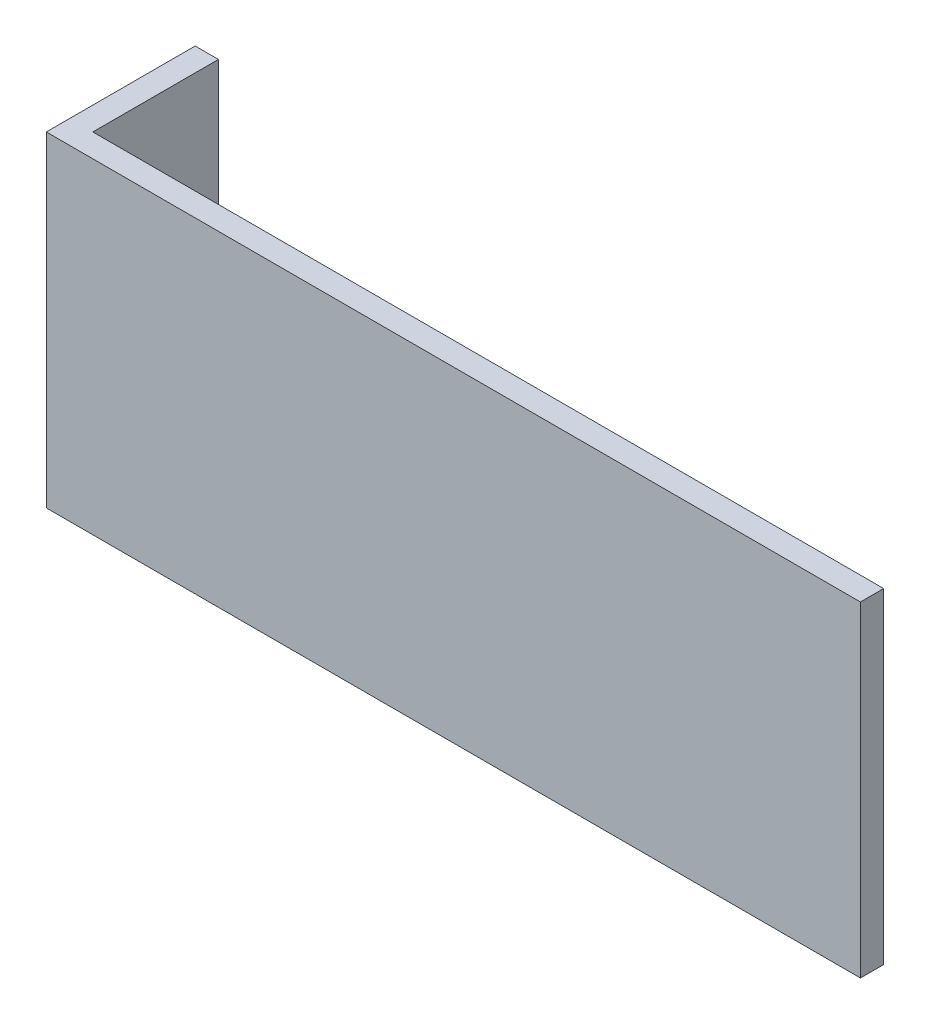
ISO-10303-21;
HEADER;
FILE_DESCRIPTION(('STEP AP214'),'2;1');
FILE_NAME('part.step','',(''),(''),'','','');
FILE_SCHEMA(('AUTOMOTIVE_DESIGN { 1 0 10303 214 1 1 1 1 }'));
ENDSEC;
DATA;
#1=APPLICATION_CONTEXT('core data for automotive mechanical design processes');
#2=APPLICATION_PROTOCOL_DEFINITION('international standard','automotive_design',2000,#1);
#3=PRODUCT_CONTEXT('',#1,'mechanical');
#4=PRODUCT('Part','Part','',(#3));
#5=PRODUCT_RELATED_PRODUCT_CATEGORY('part','',(#4));
#6=PRODUCT_DEFINITION_FORMATION('','',#4);
#7=PRODUCT_DEFINITION_CONTEXT('part definition',#1,'design');
#8=PRODUCT_DEFINITION('design','',#6,#7);
#9=PRODUCT_DEFINITION_SHAPE('','',#8);
#10=(LENGTH_UNIT() NAMED_UNIT(*) SI_UNIT(.MILLI.,.METRE.));
#11=(NAMED_UNIT(*) PLANE_ANGLE_UNIT() SI_UNIT($,.RADIAN.));
#12=(NAMED_UNIT(*) SI_UNIT($,.STERADIAN.) SOLID_ANGLE_UNIT());
#13=UNCERTAINTY_MEASURE_WITH_UNIT(LENGTH_MEASURE(1.E-05),#10,'distance_accuracy_value','');
#14=(GEOMETRIC_REPRESENTATION_CONTEXT(3) GLOBAL_UNCERTAINTY_ASSIGNED_CONTEXT((#13)) GLOBAL_UNIT_ASSIGNED_CONTEXT((#10,
#11,#12)) REPRESENTATION_CONTEXT('',''));
#15=CARTESIAN_POINT('',(0.,0.,0.));
#16=DIRECTION('',(0.,0.,1.));
#17=DIRECTION('',(1.,0.,0.));
#18=AXIS2_PLACEMENT_3D('',#15,#16,#17);
#19=CARTESIAN_POINT('',(-5.,70.,0.));
#20=DIRECTION('',(-1.,0.,0.));
#21=DIRECTION('',(0.,0.,1.));
#22=AXIS2_PLACEMENT_3D('',#19,#20,#21);
#23=PLANE('',#22);
#24=DIRECTION('',(0.,0.,-1.));
#25=VECTOR('',#24,1.);
#26=CARTESIAN_POINT('',(-5.,0.,0.));
#27=LINE('',#26,#25);
#28=CARTESIAN_POINT('',(-5.,0.,0.));
#29=VERTEX_POINT('',#28);
#30=CARTESIAN_POINT('',(-5.,0.,-32.));
#31=VERTEX_POINT('',#30);
#32=EDGE_CURVE('E123',#29,#31,#27,.T.);
#33=ORIENTED_EDGE('',*,*,#32,.F.);
#34=DIRECTION('',(0.,-1.,0.));
#35=VECTOR('',#34,1.);
#36=CARTESIAN_POINT('',(-5.,70.,0.));
#37=LINE('',#36,#35);
#38=CARTESIAN_POINT('',(-5.,70.,0.));
#39=VERTEX_POINT('',#38);
#40=EDGE_CURVE('E116',#39,#29,#37,.T.);
#41=ORIENTED_EDGE('',*,*,#40,.F.);
#42=DIRECTION('',(0.,0.,-1.));
#43=VECTOR('',#42,1.);
#44=CARTESIAN_POINT('',(-5.,70.,0.));
#45=LINE('',#44,#43);
#46=CARTESIAN_POINT('',(-5.,70.,-32.));
#47=VERTEX_POINT('',#46);
#48=EDGE_CURVE('E171',#39,#47,#45,.T.);
#49=ORIENTED_EDGE('',*,*,#48,.T.);
#50=DIRECTION('',(0.,-1.,0.));
#51=VECTOR('',#50,1.);
#52=CARTESIAN_POINT('',(-5.,70.,-32.));
#53=LINE('',#52,#51);
#54=EDGE_CURVE('E80',#47,#31,#53,.T.);
#55=ORIENTED_EDGE('',*,*,#54,.T.);
#56=EDGE_LOOP('',(#33,#41,#49,#55));
#57=FACE_BOUND('',#56,.T.);
#58=ADVANCED_FACE('F69',(#57),#23,.T.);
#59=CARTESIAN_POINT('',(0.,70.,-32.));
#60=DIRECTION('',(0.,0.,1.));
#61=DIRECTION('',(1.,0.,0.));
#62=AXIS2_PLACEMENT_3D('',#59,#60,#61);
#63=PLANE('',#62);
#64=DIRECTION('',(-1.,0.,0.));
#65=VECTOR('',#64,1.);
#66=CARTESIAN_POINT('',(0.,0.,-32.));
#67=LINE('',#66,#65);
#68=CARTESIAN_POINT('',(0.,0.,-32.));
#69=VERTEX_POINT('',#68);
#70=EDGE_CURVE('E131',#69,#31,#67,.T.);
#71=ORIENTED_EDGE('',*,*,#70,.T.);
#72=ORIENTED_EDGE('',*,*,#54,.F.);
#73=DIRECTION('',(-1.,0.,0.));
#74=VECTOR('',#73,1.);
#75=CARTESIAN_POINT('',(0.,70.,-32.));
#76=LINE('',#75,#74);
#77=CARTESIAN_POINT('',(0.,70.,-32.));
#78=VERTEX_POINT('',#77);
#79=EDGE_CURVE('E158',#78,#47,#76,.T.);
#80=ORIENTED_EDGE('',*,*,#79,.F.);
#81=DIRECTION('',(0.,-1.,0.));
#82=VECTOR('',#81,1.);
#83=CARTESIAN_POINT('',(0.,70.,-32.));
#84=LINE('',#83,#82);
#85=EDGE_CURVE('E151',#78,#69,#84,.T.);
#86=ORIENTED_EDGE('',*,*,#85,.T.);
#87=EDGE_LOOP('',(#71,#72,#80,#86));
#88=FACE_BOUND('',#87,.T.);
#89=ADVANCED_FACE('F189',(#88),#63,.F.);
#90=CARTESIAN_POINT('',(0.,0.,0.));
#91=DIRECTION('',(0.,-1.,0.));
#92=DIRECTION('',(0.,0.,-1.));
#93=AXIS2_PLACEMENT_3D('',#90,#91,#92);
#94=PLANE('',#93);
#95=ORIENTED_EDGE('',*,*,#70,.F.);
#96=DIRECTION('',(0.,0.,-1.));
#97=VECTOR('',#96,1.);
#98=CARTESIAN_POINT('',(0.,0.,0.));
#99=LINE('',#98,#97);
#100=CARTESIAN_POINT('',(0.,0.,-5.));
#101=VERTEX_POINT('',#100);
#102=EDGE_CURVE('E122',#101,#69,#99,.T.);
#103=ORIENTED_EDGE('',*,*,#102,.F.);
#104=DIRECTION('',(1.,0.,0.));
#105=VECTOR('',#104,1.);
#106=CARTESIAN_POINT('',(0.,0.,-5.));
#107=LINE('',#106,#105);
#108=CARTESIAN_POINT('',(170.,0.,-5.00000000000001));
#109=VERTEX_POINT('',#108);
#110=EDGE_CURVE('E135',#101,#109,#107,.T.);
#111=ORIENTED_EDGE('',*,*,#110,.T.);
#112=DIRECTION('',(0.,0.,-1.));
#113=VECTOR('',#112,1.);
#114=CARTESIAN_POINT('',(170.,0.,0.));
#115=LINE('',#114,#113);
#116=CARTESIAN_POINT('',(170.,0.,0.));
#117=VERTEX_POINT('',#116);
#118=EDGE_CURVE('E127',#117,#109,#115,.T.);
#119=ORIENTED_EDGE('',*,*,#118,.F.);
#120=DIRECTION('',(-1.,0.,0.));
#121=VECTOR('',#120,1.);
#122=CARTESIAN_POINT('',(0.,0.,0.));
#123=LINE('',#122,#121);
#124=EDGE_CURVE('E108',#117,#29,#123,.T.);
#125=ORIENTED_EDGE('',*,*,#124,.T.);
#126=ORIENTED_EDGE('',*,*,#32,.T.);
#127=EDGE_LOOP('',(#95,#103,#111,#119,#125,#126));
#128=FACE_BOUND('',#127,.T.);
#129=ADVANCED_FACE('F133',(#128),#94,.T.);
#130=CARTESIAN_POINT('',(0.,70.,0.));
#131=DIRECTION('',(0.,-1.,0.));
#132=DIRECTION('',(0.,0.,-1.));
#133=AXIS2_PLACEMENT_3D('',#130,#131,#132);
#134=PLANE('',#133);
#135=ORIENTED_EDGE('',*,*,#79,.T.);
#136=ORIENTED_EDGE('',*,*,#48,.F.);
#137=DIRECTION('',(-1.,0.,0.));
#138=VECTOR('',#137,1.);
#139=CARTESIAN_POINT('',(0.,70.,0.));
#140=LINE('',#139,#138);
#141=CARTESIAN_POINT('',(170.,70.,0.));
#142=VERTEX_POINT('',#141);
#143=EDGE_CURVE('E168',#142,#39,#140,.T.);
#144=ORIENTED_EDGE('',*,*,#143,.F.);
#145=DIRECTION('',(0.,0.,-1.));
#146=VECTOR('',#145,1.);
#147=CARTESIAN_POINT('',(170.,70.,0.));
#148=LINE('',#147,#146);
#149=CARTESIAN_POINT('',(170.,70.,-5.00000000000001));
#150=VERTEX_POINT('',#149);
#151=EDGE_CURVE('E129',#142,#150,#148,.T.);
#152=ORIENTED_EDGE('',*,*,#151,.T.);
#153=DIRECTION('',(1.,0.,0.));
#154=VECTOR('',#153,1.);
#155=CARTESIAN_POINT('',(0.,70.,-5.));
#156=LINE('',#155,#154);
#157=CARTESIAN_POINT('',(0.,70.,-5.));
#158=VERTEX_POINT('',#157);
#159=EDGE_CURVE('E137',#158,#150,#156,.T.);
#160=ORIENTED_EDGE('',*,*,#159,.F.);
#161=DIRECTION('',(0.,0.,-1.));
#162=VECTOR('',#161,1.);
#163=CARTESIAN_POINT('',(0.,70.,0.));
#164=LINE('',#163,#162);
#165=EDGE_CURVE('E155',#158,#78,#164,.T.);
#166=ORIENTED_EDGE('',*,*,#165,.T.);
#167=EDGE_LOOP('',(#135,#136,#144,#152,#160,#166));
#168=FACE_BOUND('',#167,.T.);
#169=ADVANCED_FACE('F182',(#168),#134,.F.);
#170=CARTESIAN_POINT('',(0.,70.,0.));
#171=DIRECTION('',(-1.,0.,0.));
#172=DIRECTION('',(0.,0.,1.));
#173=AXIS2_PLACEMENT_3D('',#170,#171,#172);
#174=PLANE('',#173);
#175=ORIENTED_EDGE('',*,*,#165,.F.);
#176=DIRECTION('',(0.,-1.,0.));
#177=VECTOR('',#176,1.);
#178=CARTESIAN_POINT('',(0.,70.,-5.));
#179=LINE('',#178,#177);
#180=EDGE_CURVE('E12',#158,#101,#179,.T.);
#181=ORIENTED_EDGE('',*,*,#180,.T.);
#182=ORIENTED_EDGE('',*,*,#102,.T.);
#183=ORIENTED_EDGE('',*,*,#85,.F.);
#184=EDGE_LOOP('',(#175,#181,#182,#183));
#185=FACE_BOUND('',#184,.T.);
#186=ADVANCED_FACE('F196',(#185),#174,.F.);
#187=CARTESIAN_POINT('',(0.,70.,0.));
#188=DIRECTION('',(0.,0.,1.));
#189=DIRECTION('',(1.,0.,0.));
#190=AXIS2_PLACEMENT_3D('',#187,#188,#189);
#191=PLANE('',#190);
#192=ORIENTED_EDGE('',*,*,#124,.F.);
#193=DIRECTION('',(0.,-1.,0.));
#194=VECTOR('',#193,1.);
#195=CARTESIAN_POINT('',(170.,70.,0.));
#196=LINE('',#195,#194);
#197=EDGE_CURVE('E112',#142,#117,#196,.T.);
#198=ORIENTED_EDGE('',*,*,#197,.F.);
#199=ORIENTED_EDGE('',*,*,#143,.T.);
#200=ORIENTED_EDGE('',*,*,#40,.T.);
#201=EDGE_LOOP('',(#192,#198,#199,#200));
#202=FACE_BOUND('',#201,.T.);
#203=ADVANCED_FACE('F110',(#202),#191,.T.);
#204=CARTESIAN_POINT('',(170.,70.,0.));
#205=DIRECTION('',(-1.,0.,0.));
#206=DIRECTION('',(0.,0.,1.));
#207=AXIS2_PLACEMENT_3D('',#204,#205,#206);
#208=PLANE('',#207);
#209=ORIENTED_EDGE('',*,*,#118,.T.);
#210=DIRECTION('',(0.,-1.,0.));
#211=VECTOR('',#210,1.);
#212=CARTESIAN_POINT('',(170.,70.,-5.00000000000001));
#213=LINE('',#212,#211);
#214=EDGE_CURVE('E73',#150,#109,#213,.T.);
#215=ORIENTED_EDGE('',*,*,#214,.F.);
#216=ORIENTED_EDGE('',*,*,#151,.F.);
#217=ORIENTED_EDGE('',*,*,#197,.T.);
#218=EDGE_LOOP('',(#209,#215,#216,#217));
#219=FACE_BOUND('',#218,.T.);
#220=ADVANCED_FACE('F126',(#219),#208,.F.);
#221=CARTESIAN_POINT('',(0.,70.,-5.));
#222=DIRECTION('',(0.,0.,-1.));
#223=DIRECTION('',(-1.,0.,0.));
#224=AXIS2_PLACEMENT_3D('',#221,#222,#223);
#225=PLANE('',#224);
#226=ORIENTED_EDGE('',*,*,#110,.F.);
#227=ORIENTED_EDGE('',*,*,#180,.F.);
#228=ORIENTED_EDGE('',*,*,#159,.T.);
#229=ORIENTED_EDGE('',*,*,#214,.T.);
#230=EDGE_LOOP('',(#226,#227,#228,#229));
#231=FACE_BOUND('',#230,.T.);
#232=ADVANCED_FACE('F71',(#231),#225,.T.);
#233=CLOSED_SHELL('',(#58,#89,#129,#169,#186,#203,#220,#232));
#234=MANIFOLD_SOLID_BREP('B2',#233);
#235=ADVANCED_BREP_SHAPE_REPRESENTATION('',(#18,#234),#14);
#236=SHAPE_DEFINITION_REPRESENTATION(#9,#235);
ENDSEC;
END-ISO-10303-21;
